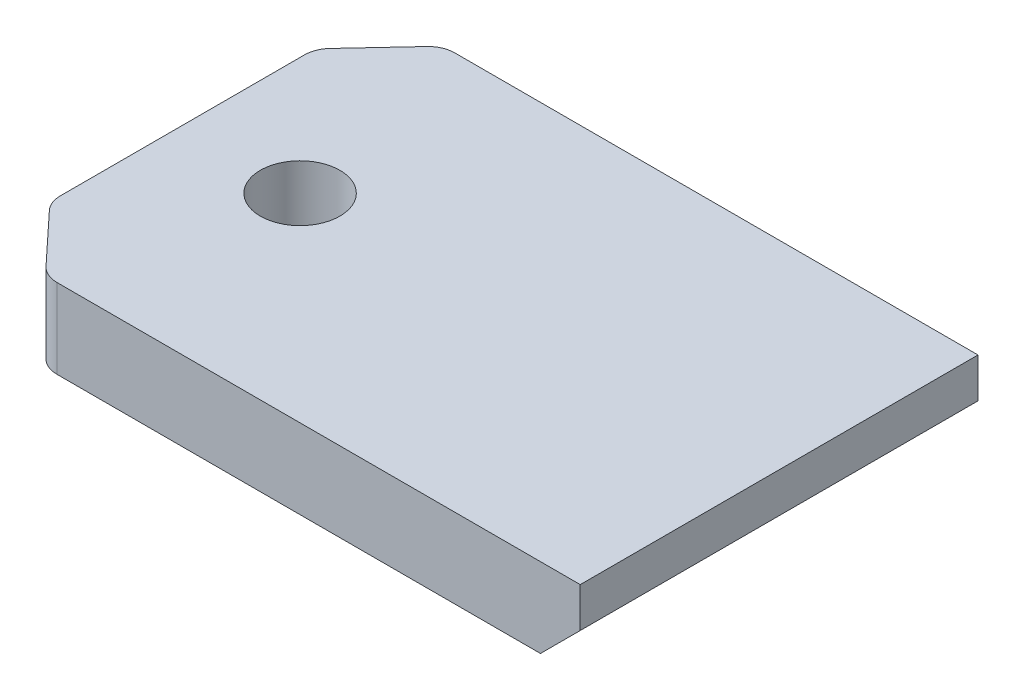
ISO-10303-21;
HEADER;
FILE_DESCRIPTION(('STEP AP214'),'2;1');
FILE_NAME('part.step','',(''),(''),'','','');
FILE_SCHEMA(('AUTOMOTIVE_DESIGN { 1 0 10303 214 1 1 1 1 }'));
ENDSEC;
DATA;
#1=APPLICATION_CONTEXT('core data for automotive mechanical design processes');
#2=APPLICATION_PROTOCOL_DEFINITION('international standard','automotive_design',2000,#1);
#3=PRODUCT_CONTEXT('',#1,'mechanical');
#4=PRODUCT('Part','Part','',(#3));
#5=PRODUCT_RELATED_PRODUCT_CATEGORY('part','',(#4));
#6=PRODUCT_DEFINITION_FORMATION('','',#4);
#7=PRODUCT_DEFINITION_CONTEXT('part definition',#1,'design');
#8=PRODUCT_DEFINITION('design','',#6,#7);
#9=PRODUCT_DEFINITION_SHAPE('','',#8);
#10=(LENGTH_UNIT() NAMED_UNIT(*) SI_UNIT(.MILLI.,.METRE.));
#11=(NAMED_UNIT(*) PLANE_ANGLE_UNIT() SI_UNIT($,.RADIAN.));
#12=(NAMED_UNIT(*) SI_UNIT($,.STERADIAN.) SOLID_ANGLE_UNIT());
#13=UNCERTAINTY_MEASURE_WITH_UNIT(LENGTH_MEASURE(1.E-05),#10,'distance_accuracy_value','');
#14=(GEOMETRIC_REPRESENTATION_CONTEXT(3) GLOBAL_UNCERTAINTY_ASSIGNED_CONTEXT((#13)) GLOBAL_UNIT_ASSIGNED_CONTEXT((#10,
#11,#12)) REPRESENTATION_CONTEXT('',''));
#15=CARTESIAN_POINT('',(0.,0.,0.));
#16=DIRECTION('',(0.,0.,1.));
#17=DIRECTION('',(1.,0.,0.));
#18=AXIS2_PLACEMENT_3D('',#15,#16,#17);
#19=CARTESIAN_POINT('',(45.,0.,0.));
#20=DIRECTION('',(0.,0.,-1.));
#21=DIRECTION('',(0.,1.,0.));
#22=AXIS2_PLACEMENT_3D('',#19,#20,#21);
#23=PLANE('',#22);
#24=DIRECTION('',(-1.,0.,0.));
#25=VECTOR('',#24,1.);
#26=CARTESIAN_POINT('',(45.,0.,0.));
#27=LINE('',#26,#25);
#28=CARTESIAN_POINT('',(45.,0.,0.));
#29=VERTEX_POINT('',#28);
#30=CARTESIAN_POINT('',(5.5322001806102,0.,0.));
#31=VERTEX_POINT('',#30);
#32=EDGE_CURVE('E135',#29,#31,#27,.T.);
#33=ORIENTED_EDGE('',*,*,#32,.T.);
#34=DIRECTION('',(0.,1.,0.));
#35=VECTOR('',#34,1.);
#36=CARTESIAN_POINT('',(5.53220018061019,-6.,0.));
#37=LINE('',#36,#35);
#38=CARTESIAN_POINT('',(5.5322001806102,-6.,0.));
#39=VERTEX_POINT('',#38);
#40=EDGE_CURVE('E172',#31,#39,#37,.F.);
#41=ORIENTED_EDGE('',*,*,#40,.T.);
#42=DIRECTION('',(-1.,0.,0.));
#43=VECTOR('',#42,1.);
#44=CARTESIAN_POINT('',(45.,-6.,0.));
#45=LINE('',#44,#43);
#46=CARTESIAN_POINT('',(42.,-6.,0.));
#47=VERTEX_POINT('',#46);
#48=EDGE_CURVE('E152',#47,#39,#45,.T.);
#49=ORIENTED_EDGE('',*,*,#48,.F.);
#50=DIRECTION('',(0.707106781186549,0.707106781186546,0.));
#51=VECTOR('',#50,1.);
#52=CARTESIAN_POINT('',(45.,-3.00000000000001,0.));
#53=LINE('',#52,#51);
#54=CARTESIAN_POINT('',(45.,-3.,0.));
#55=VERTEX_POINT('',#54);
#56=EDGE_CURVE('E160',#47,#55,#53,.T.);
#57=ORIENTED_EDGE('',*,*,#56,.T.);
#58=DIRECTION('',(0.,-1.,0.));
#59=VECTOR('',#58,1.);
#60=CARTESIAN_POINT('',(45.,0.,0.));
#61=LINE('',#60,#59);
#62=EDGE_CURVE('E127',#29,#55,#61,.T.);
#63=ORIENTED_EDGE('',*,*,#62,.F.);
#64=EDGE_LOOP('',(#33,#41,#49,#57,#63));
#65=FACE_BOUND('',#64,.T.);
#66=ADVANCED_FACE('F31',(#65),#23,.F.);
#67=CARTESIAN_POINT('',(45.,-6.,0.));
#68=DIRECTION('',(0.,1.,0.));
#69=DIRECTION('',(0.,0.,1.));
#70=AXIS2_PLACEMENT_3D('',#67,#68,#69);
#71=PLANE('',#70);
#72=CARTESIAN_POINT('',(8.86993336982875,-6.,-14.9999994918353));
#73=DIRECTION('',(0.,1.,0.));
#74=DIRECTION('',(0.,0.,1.));
#75=AXIS2_PLACEMENT_3D('',#72,#73,#74);
#76=CIRCLE('',#75,3.);
#77=CARTESIAN_POINT('',(8.86993336982875,-6.,-11.9999994918353));
#78=VERTEX_POINT('',#77);
#79=EDGE_CURVE('E149',#78,#78,#76,.T.);
#80=ORIENTED_EDGE('',*,*,#79,.T.);
#81=EDGE_LOOP('',(#80));
#82=FACE_BOUND('',#81,.T.);
#83=ORIENTED_EDGE('',*,*,#48,.T.);
#84=CARTESIAN_POINT('',(5.53220018061019,-6.,-2.));
#85=DIRECTION('',(0.,1.,0.));
#86=DIRECTION('',(0.,0.,1.));
#87=AXIS2_PLACEMENT_3D('',#84,#85,#86);
#88=CIRCLE('',#87,2.);
#89=CARTESIAN_POINT('',(4.06949277737184,-6.,-0.636003279875002));
#90=VERTEX_POINT('',#89);
#91=EDGE_CURVE('E181',#39,#90,#88,.F.);
#92=ORIENTED_EDGE('',*,*,#91,.T.);
#93=DIRECTION('',(0.681998360062498,0.,0.731353701619171));
#94=VECTOR('',#93,1.);
#95=CARTESIAN_POINT('',(4.66257543068831,-6.,0.));
#96=LINE('',#95,#94);
#97=CARTESIAN_POINT('',(0.537292596761657,-6.,-4.4238242311049));
#98=VERTEX_POINT('',#97);
#99=EDGE_CURVE('E166',#90,#98,#96,.F.);
#100=ORIENTED_EDGE('',*,*,#99,.T.);
#101=CARTESIAN_POINT('',(2.,-6.,-5.7878209512299));
#102=DIRECTION('',(0.,1.,0.));
#103=DIRECTION('',(0.,0.,1.));
#104=AXIS2_PLACEMENT_3D('',#101,#102,#103);
#105=CIRCLE('',#104,2.);
#106=CARTESIAN_POINT('',(0.,-6.,-5.7878209512299));
#107=VERTEX_POINT('',#106);
#108=EDGE_CURVE('E179',#98,#107,#105,.F.);
#109=ORIENTED_EDGE('',*,*,#108,.T.);
#110=DIRECTION('',(0.,0.,-1.));
#111=VECTOR('',#110,1.);
#112=CARTESIAN_POINT('',(0.,-6.,0.));
#113=LINE('',#112,#111);
#114=CARTESIAN_POINT('',(0.,-6.,-24.2121790487701));
#115=VERTEX_POINT('',#114);
#116=EDGE_CURVE('E145',#107,#115,#113,.T.);
#117=ORIENTED_EDGE('',*,*,#116,.T.);
#118=CARTESIAN_POINT('',(2.,-6.,-24.2121790487701));
#119=DIRECTION('',(0.,1.,0.));
#120=DIRECTION('',(0.,0.,1.));
#121=AXIS2_PLACEMENT_3D('',#118,#119,#120);
#122=CIRCLE('',#121,2.);
#123=CARTESIAN_POINT('',(0.537292596761658,-6.,-25.5761757688951));
#124=VERTEX_POINT('',#123);
#125=EDGE_CURVE('E177',#115,#124,#122,.F.);
#126=ORIENTED_EDGE('',*,*,#125,.T.);
#127=DIRECTION('',(-0.681998360062498,0.,0.731353701619171));
#128=VECTOR('',#127,1.);
#129=CARTESIAN_POINT('',(4.66257543068831,-6.,-30.));
#130=LINE('',#129,#128);
#131=CARTESIAN_POINT('',(4.06949277737184,-6.,-29.363996720125));
#132=VERTEX_POINT('',#131);
#133=EDGE_CURVE('E169',#124,#132,#130,.F.);
#134=ORIENTED_EDGE('',*,*,#133,.T.);
#135=CARTESIAN_POINT('',(5.53220018061018,-6.,-28.));
#136=DIRECTION('',(0.,1.,0.));
#137=DIRECTION('',(0.,0.,1.));
#138=AXIS2_PLACEMENT_3D('',#135,#136,#137);
#139=CIRCLE('',#138,2.);
#140=CARTESIAN_POINT('',(5.53220018061019,-6.,-30.));
#141=VERTEX_POINT('',#140);
#142=EDGE_CURVE('E175',#132,#141,#139,.F.);
#143=ORIENTED_EDGE('',*,*,#142,.T.);
#144=DIRECTION('',(-1.,0.,0.));
#145=VECTOR('',#144,1.);
#146=CARTESIAN_POINT('',(45.,-6.,-30.));
#147=LINE('',#146,#145);
#148=CARTESIAN_POINT('',(42.,-6.,-30.));
#149=VERTEX_POINT('',#148);
#150=EDGE_CURVE('E134',#149,#141,#147,.T.);
#151=ORIENTED_EDGE('',*,*,#150,.F.);
#152=DIRECTION('',(0.,0.,1.));
#153=VECTOR('',#152,1.);
#154=CARTESIAN_POINT('',(42.,-6.,0.));
#155=LINE('',#154,#153);
#156=EDGE_CURVE('E158',#149,#47,#155,.T.);
#157=ORIENTED_EDGE('',*,*,#156,.T.);
#158=EDGE_LOOP('',(#83,#92,#100,#109,#117,#126,#134,#143,#151,#157));
#159=FACE_BOUND('',#158,.T.);
#160=ADVANCED_FACE('F212',(#82,#159),#71,.F.);
#161=CARTESIAN_POINT('',(45.,0.,-30.));
#162=DIRECTION('',(0.,0.,1.));
#163=DIRECTION('',(1.,0.,0.));
#164=AXIS2_PLACEMENT_3D('',#161,#162,#163);
#165=PLANE('',#164);
#166=ORIENTED_EDGE('',*,*,#150,.T.);
#167=DIRECTION('',(0.,-1.,0.));
#168=VECTOR('',#167,1.);
#169=CARTESIAN_POINT('',(5.53220018061018,0.,-30.));
#170=LINE('',#169,#168);
#171=CARTESIAN_POINT('',(5.53220018061019,0.,-30.));
#172=VERTEX_POINT('',#171);
#173=EDGE_CURVE('E11',#141,#172,#170,.F.);
#174=ORIENTED_EDGE('',*,*,#173,.T.);
#175=DIRECTION('',(-1.,0.,0.));
#176=VECTOR('',#175,1.);
#177=CARTESIAN_POINT('',(45.,0.,-30.));
#178=LINE('',#177,#176);
#179=CARTESIAN_POINT('',(45.,0.,-30.));
#180=VERTEX_POINT('',#179);
#181=EDGE_CURVE('E130',#180,#172,#178,.T.);
#182=ORIENTED_EDGE('',*,*,#181,.F.);
#183=DIRECTION('',(0.,1.,0.));
#184=VECTOR('',#183,1.);
#185=CARTESIAN_POINT('',(45.,0.,-30.));
#186=LINE('',#185,#184);
#187=CARTESIAN_POINT('',(45.,-3.,-30.));
#188=VERTEX_POINT('',#187);
#189=EDGE_CURVE('E117',#188,#180,#186,.T.);
#190=ORIENTED_EDGE('',*,*,#189,.F.);
#191=DIRECTION('',(-0.707106781186549,-0.707106781186546,0.));
#192=VECTOR('',#191,1.);
#193=CARTESIAN_POINT('',(45.,-3.00000000000001,-30.));
#194=LINE('',#193,#192);
#195=EDGE_CURVE('E156',#188,#149,#194,.T.);
#196=ORIENTED_EDGE('',*,*,#195,.T.);
#197=EDGE_LOOP('',(#166,#174,#182,#190,#196));
#198=FACE_BOUND('',#197,.T.);
#199=ADVANCED_FACE('F132',(#198),#165,.F.);
#200=CARTESIAN_POINT('',(45.,0.,0.));
#201=DIRECTION('',(0.,-1.,0.));
#202=DIRECTION('',(0.,0.,-1.));
#203=AXIS2_PLACEMENT_3D('',#200,#201,#202);
#204=PLANE('',#203);
#205=CARTESIAN_POINT('',(8.86993336982875,0.,-14.9999994918353));
#206=DIRECTION('',(0.,1.,0.));
#207=DIRECTION('',(0.,0.,1.));
#208=AXIS2_PLACEMENT_3D('',#205,#206,#207);
#209=CIRCLE('',#208,3.);
#210=CARTESIAN_POINT('',(8.86993336982875,0.,-11.9999994918353));
#211=VERTEX_POINT('',#210);
#212=EDGE_CURVE('E228',#211,#211,#209,.T.);
#213=ORIENTED_EDGE('',*,*,#212,.F.);
#214=EDGE_LOOP('',(#213));
#215=FACE_BOUND('',#214,.T.);
#216=DIRECTION('',(-0.681998360062498,0.,-0.731353701619171));
#217=VECTOR('',#216,1.);
#218=CARTESIAN_POINT('',(4.66257543068831,0.,0.));
#219=LINE('',#218,#217);
#220=CARTESIAN_POINT('',(0.537292596761658,0.,-4.4238242311049));
#221=VERTEX_POINT('',#220);
#222=CARTESIAN_POINT('',(4.06949277737184,0.,-0.636003279875001));
#223=VERTEX_POINT('',#222);
#224=EDGE_CURVE('E162',#221,#223,#219,.F.);
#225=ORIENTED_EDGE('',*,*,#224,.T.);
#226=CARTESIAN_POINT('',(5.53220018061019,0.,-2.));
#227=DIRECTION('',(0.,-1.,0.));
#228=DIRECTION('',(0.,0.,-1.));
#229=AXIS2_PLACEMENT_3D('',#226,#227,#228);
#230=CIRCLE('',#229,2.);
#231=EDGE_CURVE('E191',#223,#31,#230,.F.);
#232=ORIENTED_EDGE('',*,*,#231,.T.);
#233=ORIENTED_EDGE('',*,*,#32,.F.);
#234=DIRECTION('',(0.,0.,1.));
#235=VECTOR('',#234,1.);
#236=CARTESIAN_POINT('',(45.,0.,0.));
#237=LINE('',#236,#235);
#238=EDGE_CURVE('E122',#180,#29,#237,.T.);
#239=ORIENTED_EDGE('',*,*,#238,.F.);
#240=ORIENTED_EDGE('',*,*,#181,.T.);
#241=CARTESIAN_POINT('',(5.53220018061018,0.,-28.));
#242=DIRECTION('',(0.,-1.,0.));
#243=DIRECTION('',(0.,0.,-1.));
#244=AXIS2_PLACEMENT_3D('',#241,#242,#243);
#245=CIRCLE('',#244,2.);
#246=CARTESIAN_POINT('',(4.06949277737184,0.,-29.363996720125));
#247=VERTEX_POINT('',#246);
#248=EDGE_CURVE('E187',#172,#247,#245,.F.);
#249=ORIENTED_EDGE('',*,*,#248,.T.);
#250=DIRECTION('',(0.681998360062498,0.,-0.731353701619171));
#251=VECTOR('',#250,1.);
#252=CARTESIAN_POINT('',(4.66257543068831,0.,-30.));
#253=LINE('',#252,#251);
#254=CARTESIAN_POINT('',(0.537292596761658,0.,-25.5761757688951));
#255=VERTEX_POINT('',#254);
#256=EDGE_CURVE('E164',#247,#255,#253,.F.);
#257=ORIENTED_EDGE('',*,*,#256,.T.);
#258=CARTESIAN_POINT('',(2.,0.,-24.2121790487701));
#259=DIRECTION('',(0.,-1.,0.));
#260=DIRECTION('',(0.,0.,-1.));
#261=AXIS2_PLACEMENT_3D('',#258,#259,#260);
#262=CIRCLE('',#261,2.);
#263=CARTESIAN_POINT('',(0.,0.,-24.2121790487701));
#264=VERTEX_POINT('',#263);
#265=EDGE_CURVE('E54',#255,#264,#262,.F.);
#266=ORIENTED_EDGE('',*,*,#265,.T.);
#267=DIRECTION('',(0.,0.,1.));
#268=VECTOR('',#267,1.);
#269=CARTESIAN_POINT('',(0.,0.,0.));
#270=LINE('',#269,#268);
#271=CARTESIAN_POINT('',(0.,0.,-5.7878209512299));
#272=VERTEX_POINT('',#271);
#273=EDGE_CURVE('E148',#264,#272,#270,.T.);
#274=ORIENTED_EDGE('',*,*,#273,.T.);
#275=CARTESIAN_POINT('',(2.,0.,-5.7878209512299));
#276=DIRECTION('',(0.,-1.,0.));
#277=DIRECTION('',(0.,0.,-1.));
#278=AXIS2_PLACEMENT_3D('',#275,#276,#277);
#279=CIRCLE('',#278,2.);
#280=EDGE_CURVE('E46',#272,#221,#279,.F.);
#281=ORIENTED_EDGE('',*,*,#280,.T.);
#282=EDGE_LOOP('',(#225,#232,#233,#239,#240,#249,#257,#266,#274,#281));
#283=FACE_BOUND('',#282,.T.);
#284=ADVANCED_FACE('F138',(#215,#283),#204,.F.);
#285=CARTESIAN_POINT('',(45.,-6.,0.));
#286=DIRECTION('',(1.,0.,0.));
#287=DIRECTION('',(0.,0.,-1.));
#288=AXIS2_PLACEMENT_3D('',#285,#286,#287);
#289=PLANE('',#288);
#290=ORIENTED_EDGE('',*,*,#62,.T.);
#291=DIRECTION('',(0.,0.,-1.));
#292=VECTOR('',#291,1.);
#293=CARTESIAN_POINT('',(45.,-3.00000000000001,-30.));
#294=LINE('',#293,#292);
#295=EDGE_CURVE('E125',#55,#188,#294,.T.);
#296=ORIENTED_EDGE('',*,*,#295,.T.);
#297=ORIENTED_EDGE('',*,*,#189,.T.);
#298=ORIENTED_EDGE('',*,*,#238,.T.);
#299=EDGE_LOOP('',(#290,#296,#297,#298));
#300=FACE_BOUND('',#299,.T.);
#301=ADVANCED_FACE('F120',(#300),#289,.T.);
#302=CARTESIAN_POINT('',(0.,-6.,0.));
#303=DIRECTION('',(1.,0.,0.));
#304=DIRECTION('',(0.,0.,-1.));
#305=AXIS2_PLACEMENT_3D('',#302,#303,#304);
#306=PLANE('',#305);
#307=ORIENTED_EDGE('',*,*,#116,.F.);
#308=DIRECTION('',(0.,-1.,0.));
#309=VECTOR('',#308,1.);
#310=CARTESIAN_POINT('',(0.,0.,-5.7878209512299));
#311=LINE('',#310,#309);
#312=EDGE_CURVE('E196',#107,#272,#311,.F.);
#313=ORIENTED_EDGE('',*,*,#312,.T.);
#314=ORIENTED_EDGE('',*,*,#273,.F.);
#315=DIRECTION('',(0.,1.,0.));
#316=VECTOR('',#315,1.);
#317=CARTESIAN_POINT('',(0.,-6.,-24.2121790487701));
#318=LINE('',#317,#316);
#319=EDGE_CURVE('E193',#264,#115,#318,.F.);
#320=ORIENTED_EDGE('',*,*,#319,.T.);
#321=EDGE_LOOP('',(#307,#313,#314,#320));
#322=FACE_BOUND('',#321,.T.);
#323=ADVANCED_FACE('F210',(#322),#306,.F.);
#324=CARTESIAN_POINT('',(45.,-3.00000000000001,0.));
#325=DIRECTION('',(0.707106781186546,-0.707106781186549,0.));
#326=DIRECTION('',(0.707106781186549,0.707106781186546,0.));
#327=AXIS2_PLACEMENT_3D('',#324,#325,#326);
#328=PLANE('',#327);
#329=ORIENTED_EDGE('',*,*,#56,.F.);
#330=ORIENTED_EDGE('',*,*,#156,.F.);
#331=ORIENTED_EDGE('',*,*,#195,.F.);
#332=ORIENTED_EDGE('',*,*,#295,.F.);
#333=EDGE_LOOP('',(#329,#330,#331,#332));
#334=FACE_BOUND('',#333,.T.);
#335=ADVANCED_FACE('F238',(#334),#328,.T.);
#336=CARTESIAN_POINT('',(8.86993336982875,-6.,-14.9999994918353));
#337=DIRECTION('',(0.,1.,0.));
#338=DIRECTION('',(0.,0.,1.));
#339=AXIS2_PLACEMENT_3D('',#336,#337,#338);
#340=CYLINDRICAL_SURFACE('',#339,3.);
#341=CARTESIAN_POINT('',(8.86993336982875,-6.,-11.9999994918353));
#342=CARTESIAN_POINT('',(8.86993336982875,-5.9375,-11.9999994918353));
#343=CARTESIAN_POINT('',(8.86993336982875,-5.875,-11.9999994918353));
#344=CARTESIAN_POINT('',(8.86993336982875,-5.75,-11.9999994918353));
#345=CARTESIAN_POINT('',(8.86993336982875,-5.6875,-11.9999994918353));
#346=CARTESIAN_POINT('',(8.86993336982875,-5.5625,-11.9999994918353));
#347=CARTESIAN_POINT('',(8.86993336982875,-5.5,-11.9999994918353));
#348=CARTESIAN_POINT('',(8.86993336982875,-5.375,-11.9999994918353));
#349=CARTESIAN_POINT('',(8.86993336982875,-5.3125,-11.9999994918353));
#350=CARTESIAN_POINT('',(8.86993336982875,-5.1875,-11.9999994918353));
#351=CARTESIAN_POINT('',(8.86993336982875,-5.125,-11.9999994918353));
#352=CARTESIAN_POINT('',(8.86993336982875,-5.,-11.9999994918353));
#353=CARTESIAN_POINT('',(8.86993336982875,-4.9375,-11.9999994918353));
#354=CARTESIAN_POINT('',(8.86993336982875,-4.8125,-11.9999994918353));
#355=CARTESIAN_POINT('',(8.86993336982875,-4.75,-11.9999994918353));
#356=CARTESIAN_POINT('',(8.86993336982875,-4.625,-11.9999994918353));
#357=CARTESIAN_POINT('',(8.86993336982875,-4.5625,-11.9999994918353));
#358=CARTESIAN_POINT('',(8.86993336982875,-4.4375,-11.9999994918353));
#359=CARTESIAN_POINT('',(8.86993336982875,-4.375,-11.9999994918353));
#360=CARTESIAN_POINT('',(8.86993336982875,-4.25,-11.9999994918353));
#361=CARTESIAN_POINT('',(8.86993336982875,-4.1875,-11.9999994918353));
#362=CARTESIAN_POINT('',(8.86993336982875,-4.0625,-11.9999994918353));
#363=CARTESIAN_POINT('',(8.86993336982875,-4.,-11.9999994918353));
#364=CARTESIAN_POINT('',(8.86993336982875,-3.875,-11.9999994918353));
#365=CARTESIAN_POINT('',(8.86993336982875,-3.8125,-11.9999994918353));
#366=CARTESIAN_POINT('',(8.86993336982875,-3.6875,-11.9999994918353));
#367=CARTESIAN_POINT('',(8.86993336982875,-3.625,-11.9999994918353));
#368=CARTESIAN_POINT('',(8.86993336982875,-3.5,-11.9999994918353));
#369=CARTESIAN_POINT('',(8.86993336982875,-3.4375,-11.9999994918353));
#370=CARTESIAN_POINT('',(8.86993336982875,-3.3125,-11.9999994918353));
#371=CARTESIAN_POINT('',(8.86993336982875,-3.25,-11.9999994918353));
#372=CARTESIAN_POINT('',(8.86993336982875,-3.125,-11.9999994918353));
#373=CARTESIAN_POINT('',(8.86993336982875,-3.0625,-11.9999994918353));
#374=CARTESIAN_POINT('',(8.86993336982875,-2.9375,-11.9999994918353));
#375=CARTESIAN_POINT('',(8.86993336982875,-2.875,-11.9999994918353));
#376=CARTESIAN_POINT('',(8.86993336982875,-2.75,-11.9999994918353));
#377=CARTESIAN_POINT('',(8.86993336982875,-2.6875,-11.9999994918353));
#378=CARTESIAN_POINT('',(8.86993336982875,-2.5625,-11.9999994918353));
#379=CARTESIAN_POINT('',(8.86993336982875,-2.5,-11.9999994918353));
#380=CARTESIAN_POINT('',(8.86993336982875,-2.375,-11.9999994918353));
#381=CARTESIAN_POINT('',(8.86993336982875,-2.3125,-11.9999994918353));
#382=CARTESIAN_POINT('',(8.86993336982875,-2.1875,-11.9999994918353));
#383=CARTESIAN_POINT('',(8.86993336982875,-2.125,-11.9999994918353));
#384=CARTESIAN_POINT('',(8.86993336982875,-2.,-11.9999994918353));
#385=CARTESIAN_POINT('',(8.86993336982875,-1.9375,-11.9999994918353));
#386=CARTESIAN_POINT('',(8.86993336982875,-1.8125,-11.9999994918353));
#387=CARTESIAN_POINT('',(8.86993336982875,-1.75,-11.9999994918353));
#388=CARTESIAN_POINT('',(8.86993336982875,-1.625,-11.9999994918353));
#389=CARTESIAN_POINT('',(8.86993336982875,-1.5625,-11.9999994918353));
#390=CARTESIAN_POINT('',(8.86993336982875,-1.4375,-11.9999994918353));
#391=CARTESIAN_POINT('',(8.86993336982875,-1.375,-11.9999994918353));
#392=CARTESIAN_POINT('',(8.86993336982875,-1.25,-11.9999994918353));
#393=CARTESIAN_POINT('',(8.86993336982875,-1.1875,-11.9999994918353));
#394=CARTESIAN_POINT('',(8.86993336982875,-1.0625,-11.9999994918353));
#395=CARTESIAN_POINT('',(8.86993336982875,-1.,-11.9999994918353));
#396=CARTESIAN_POINT('',(8.86993336982875,-0.875000000000001,-11.9999994918353));
#397=CARTESIAN_POINT('',(8.86993336982875,-0.812500000000001,-11.9999994918353));
#398=CARTESIAN_POINT('',(8.86993336982875,-0.687500000000001,-11.9999994918353));
#399=CARTESIAN_POINT('',(8.86993336982875,-0.625000000000001,-11.9999994918353));
#400=CARTESIAN_POINT('',(8.86993336982875,-0.5,-11.9999994918353));
#401=CARTESIAN_POINT('',(8.86993336982875,-0.4375,-11.9999994918353));
#402=CARTESIAN_POINT('',(8.86993336982875,-0.3125,-11.9999994918353));
#403=CARTESIAN_POINT('',(8.86993336982875,-0.25,-11.9999994918353));
#404=CARTESIAN_POINT('',(8.86993336982875,-0.125,-11.9999994918353));
#405=CARTESIAN_POINT('',(8.86993336982875,-0.0625000000000001,-11.9999994918353));
#406=CARTESIAN_POINT('',(8.86993336982875,0.,-11.9999994918353));
#407=B_SPLINE_CURVE_WITH_KNOTS('',3,(#341,#342,#343,#344,#345,#346,#347,#348,#349,#350,#351,
#352,#353,#354,#355,#356,#357,#358,#359,#360,#361,#362,#363,#364,#365,#366,#367,#368,#369,#370,
#371,#372,#373,#374,#375,#376,#377,#378,#379,#380,#381,#382,#383,#384,#385,#386,#387,#388,#389,
#390,#391,#392,#393,#394,#395,#396,#397,#398,#399,#400,#401,#402,#403,#404,#405,#406),
.UNSPECIFIED.,.F.,.F.,(4,2,2,2,2,2,2,2,2,2,2,2,2,2,2,2,2,2,2,2,2,2,2,2,2,2,2,2,2,2,2,2,4),(0.,
0.1875,0.375,0.5625,0.750000000000001,0.937500000000001,1.125,1.3125,1.5,1.6875,1.875,2.0625,
2.25,2.4375,2.625,2.8125,3.,3.1875,3.375,3.5625,3.75,3.9375,4.125,4.3125,4.5,4.6875,4.875,
5.0625,5.25,5.4375,5.625,5.8125,6.),.UNSPECIFIED.);
#408=EDGE_CURVE('BSEAM235',#78,#211,#407,.T.);
#409=ORIENTED_EDGE('',*,*,#79,.F.);
#410=ORIENTED_EDGE('',*,*,#212,.T.);
#411=ORIENTED_EDGE('',*,*,#408,.T.);
#412=ORIENTED_EDGE('',*,*,#408,.F.);
#413=EDGE_LOOP('',(#409,#411,#410,#412));
#414=FACE_BOUND('',#413,.T.);
#415=ADVANCED_FACE('F235',(#414),#340,.F.);
#416=CARTESIAN_POINT('',(4.66257543068831,0.,-30.));
#417=DIRECTION('',(0.731353701619171,0.,0.681998360062498));
#418=DIRECTION('',(0.681998360062498,0.,-0.731353701619171));
#419=AXIS2_PLACEMENT_3D('',#416,#417,#418);
#420=PLANE('',#419);
#421=ORIENTED_EDGE('',*,*,#133,.F.);
#422=DIRECTION('',(0.,-1.,0.));
#423=VECTOR('',#422,1.);
#424=CARTESIAN_POINT('',(0.537292596761658,0.,-25.5761757688951));
#425=LINE('',#424,#423);
#426=EDGE_CURVE('E39',#124,#255,#425,.F.);
#427=ORIENTED_EDGE('',*,*,#426,.T.);
#428=ORIENTED_EDGE('',*,*,#256,.F.);
#429=DIRECTION('',(0.,1.,0.));
#430=VECTOR('',#429,1.);
#431=CARTESIAN_POINT('',(4.06949277737184,-6.,-29.363996720125));
#432=LINE('',#431,#430);
#433=EDGE_CURVE('E198',#247,#132,#432,.F.);
#434=ORIENTED_EDGE('',*,*,#433,.T.);
#435=EDGE_LOOP('',(#421,#427,#428,#434));
#436=FACE_BOUND('',#435,.T.);
#437=ADVANCED_FACE('F203',(#436),#420,.F.);
#438=CARTESIAN_POINT('',(4.66257543068831,0.,0.));
#439=DIRECTION('',(0.731353701619171,0.,-0.681998360062498));
#440=DIRECTION('',(-0.681998360062498,0.,-0.731353701619171));
#441=AXIS2_PLACEMENT_3D('',#438,#439,#440);
#442=PLANE('',#441);
#443=ORIENTED_EDGE('',*,*,#99,.F.);
#444=DIRECTION('',(0.,-1.,0.));
#445=VECTOR('',#444,1.);
#446=CARTESIAN_POINT('',(4.06949277737184,0.,-0.636003279875001));
#447=LINE('',#446,#445);
#448=EDGE_CURVE('E185',#90,#223,#447,.F.);
#449=ORIENTED_EDGE('',*,*,#448,.T.);
#450=ORIENTED_EDGE('',*,*,#224,.F.);
#451=DIRECTION('',(0.,1.,0.));
#452=VECTOR('',#451,1.);
#453=CARTESIAN_POINT('',(0.537292596761657,-6.,-4.4238242311049));
#454=LINE('',#453,#452);
#455=EDGE_CURVE('E183',#221,#98,#454,.F.);
#456=ORIENTED_EDGE('',*,*,#455,.T.);
#457=EDGE_LOOP('',(#443,#449,#450,#456));
#458=FACE_BOUND('',#457,.T.);
#459=ADVANCED_FACE('F219',(#458),#442,.F.);
#460=CARTESIAN_POINT('',(5.53220018061019,0.,-2.));
#461=DIRECTION('',(0.,-1.,0.));
#462=DIRECTION('',(0.,0.,-1.));
#463=AXIS2_PLACEMENT_3D('',#460,#461,#462);
#464=CYLINDRICAL_SURFACE('',#463,2.);
#465=ORIENTED_EDGE('',*,*,#231,.F.);
#466=ORIENTED_EDGE('',*,*,#448,.F.);
#467=ORIENTED_EDGE('',*,*,#91,.F.);
#468=ORIENTED_EDGE('',*,*,#40,.F.);
#469=EDGE_LOOP('',(#465,#466,#467,#468));
#470=FACE_BOUND('',#469,.T.);
#471=ADVANCED_FACE('F222',(#470),#464,.T.);
#472=CARTESIAN_POINT('',(2.,-6.,-5.7878209512299));
#473=DIRECTION('',(0.,1.,0.));
#474=DIRECTION('',(0.,0.,1.));
#475=AXIS2_PLACEMENT_3D('',#472,#473,#474);
#476=CYLINDRICAL_SURFACE('',#475,2.);
#477=ORIENTED_EDGE('',*,*,#108,.F.);
#478=ORIENTED_EDGE('',*,*,#455,.F.);
#479=ORIENTED_EDGE('',*,*,#280,.F.);
#480=ORIENTED_EDGE('',*,*,#312,.F.);
#481=EDGE_LOOP('',(#477,#478,#479,#480));
#482=FACE_BOUND('',#481,.T.);
#483=ADVANCED_FACE('F215',(#482),#476,.T.);
#484=CARTESIAN_POINT('',(2.,-6.,-24.2121790487701));
#485=DIRECTION('',(0.,-1.,0.));
#486=DIRECTION('',(0.,0.,-1.));
#487=AXIS2_PLACEMENT_3D('',#484,#485,#486);
#488=CYLINDRICAL_SURFACE('',#487,2.);
#489=ORIENTED_EDGE('',*,*,#265,.F.);
#490=ORIENTED_EDGE('',*,*,#426,.F.);
#491=ORIENTED_EDGE('',*,*,#125,.F.);
#492=ORIENTED_EDGE('',*,*,#319,.F.);
#493=EDGE_LOOP('',(#489,#490,#491,#492));
#494=FACE_BOUND('',#493,.T.);
#495=ADVANCED_FACE('F207',(#494),#488,.T.);
#496=CARTESIAN_POINT('',(5.53220018061018,0.,-28.));
#497=DIRECTION('',(0.,1.,0.));
#498=DIRECTION('',(0.,0.,1.));
#499=AXIS2_PLACEMENT_3D('',#496,#497,#498);
#500=CYLINDRICAL_SURFACE('',#499,2.);
#501=ORIENTED_EDGE('',*,*,#142,.F.);
#502=ORIENTED_EDGE('',*,*,#433,.F.);
#503=ORIENTED_EDGE('',*,*,#248,.F.);
#504=ORIENTED_EDGE('',*,*,#173,.F.);
#505=EDGE_LOOP('',(#501,#502,#503,#504));
#506=FACE_BOUND('',#505,.T.);
#507=ADVANCED_FACE('F33',(#506),#500,.T.);
#508=CLOSED_SHELL('',(#66,#160,#199,#284,#301,#323,#335,#415,#437,#459,#471,#483,#495,#507));
#509=MANIFOLD_SOLID_BREP('B2',#508);
#510=ADVANCED_BREP_SHAPE_REPRESENTATION('',(#18,#509),#14);
#511=SHAPE_DEFINITION_REPRESENTATION(#9,#510);
ENDSEC;
END-ISO-10303-21;
